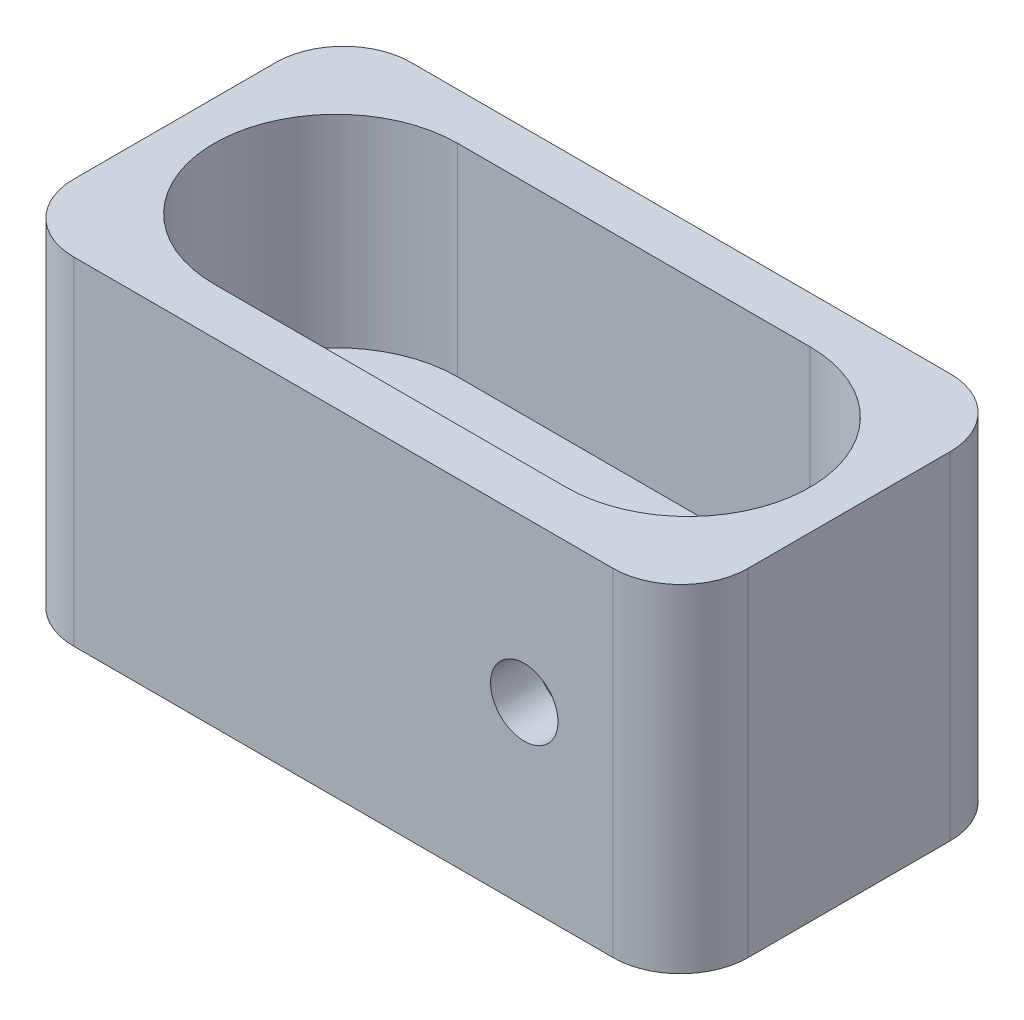
ISO-10303-21;
HEADER;
FILE_DESCRIPTION(('STEP AP214'),'2;1');
FILE_NAME('part.step','',(''),(''),'','','');
FILE_SCHEMA(('AUTOMOTIVE_DESIGN { 1 0 10303 214 1 1 1 1 }'));
ENDSEC;
DATA;
#1=APPLICATION_CONTEXT('core data for automotive mechanical design processes');
#2=APPLICATION_PROTOCOL_DEFINITION('international standard','automotive_design',2000,#1);
#3=PRODUCT_CONTEXT('',#1,'mechanical');
#4=PRODUCT('Part','Part','',(#3));
#5=PRODUCT_RELATED_PRODUCT_CATEGORY('part','',(#4));
#6=PRODUCT_DEFINITION_FORMATION('','',#4);
#7=PRODUCT_DEFINITION_CONTEXT('part definition',#1,'design');
#8=PRODUCT_DEFINITION('design','',#6,#7);
#9=PRODUCT_DEFINITION_SHAPE('','',#8);
#10=(LENGTH_UNIT() NAMED_UNIT(*) SI_UNIT(.MILLI.,.METRE.));
#11=(NAMED_UNIT(*) PLANE_ANGLE_UNIT() SI_UNIT($,.RADIAN.));
#12=(NAMED_UNIT(*) SI_UNIT($,.STERADIAN.) SOLID_ANGLE_UNIT());
#13=UNCERTAINTY_MEASURE_WITH_UNIT(LENGTH_MEASURE(1.E-05),#10,'distance_accuracy_value','');
#14=(GEOMETRIC_REPRESENTATION_CONTEXT(3) GLOBAL_UNCERTAINTY_ASSIGNED_CONTEXT((#13)) GLOBAL_UNIT_ASSIGNED_CONTEXT((#10,
#11,#12)) REPRESENTATION_CONTEXT('',''));
#15=CARTESIAN_POINT('',(0.,0.,0.));
#16=DIRECTION('',(0.,0.,1.));
#17=DIRECTION('',(1.,0.,0.));
#18=AXIS2_PLACEMENT_3D('',#15,#16,#17);
#19=CARTESIAN_POINT('',(25.,25.,12.5));
#20=DIRECTION('',(-1.,0.,0.));
#21=DIRECTION('',(0.,0.,1.));
#22=AXIS2_PLACEMENT_3D('',#19,#20,#21);
#23=PLANE('',#22);
#24=DIRECTION('',(0.,0.,-1.));
#25=VECTOR('',#24,1.);
#26=CARTESIAN_POINT('',(25.,0.,12.5));
#27=LINE('',#26,#25);
#28=CARTESIAN_POINT('',(25.,0.,7.5));
#29=VERTEX_POINT('',#28);
#30=CARTESIAN_POINT('',(25.,0.,-7.5));
#31=VERTEX_POINT('',#30);
#32=EDGE_CURVE('E162',#29,#31,#27,.T.);
#33=ORIENTED_EDGE('',*,*,#32,.T.);
#34=DIRECTION('',(0.,-1.,0.));
#35=VECTOR('',#34,1.);
#36=CARTESIAN_POINT('',(25.,25.,-7.5));
#37=LINE('',#36,#35);
#38=CARTESIAN_POINT('',(25.,25.,-7.5));
#39=VERTEX_POINT('',#38);
#40=EDGE_CURVE('E189',#31,#39,#37,.F.);
#41=ORIENTED_EDGE('',*,*,#40,.T.);
#42=DIRECTION('',(0.,0.,-1.));
#43=VECTOR('',#42,1.);
#44=CARTESIAN_POINT('',(25.,25.,12.5));
#45=LINE('',#44,#43);
#46=CARTESIAN_POINT('',(25.,25.,7.5));
#47=VERTEX_POINT('',#46);
#48=EDGE_CURVE('E148',#47,#39,#45,.T.);
#49=ORIENTED_EDGE('',*,*,#48,.F.);
#50=DIRECTION('',(0.,-1.,0.));
#51=VECTOR('',#50,1.);
#52=CARTESIAN_POINT('',(25.,25.,7.5));
#53=LINE('',#52,#51);
#54=EDGE_CURVE('E186',#47,#29,#53,.T.);
#55=ORIENTED_EDGE('',*,*,#54,.T.);
#56=EDGE_LOOP('',(#33,#41,#49,#55));
#57=FACE_BOUND('',#56,.T.);
#58=ADVANCED_FACE('F32',(#57),#23,.F.);
#59=CARTESIAN_POINT('',(-25.,25.,-12.5));
#60=DIRECTION('',(0.,0.,1.));
#61=DIRECTION('',(1.,0.,0.));
#62=AXIS2_PLACEMENT_3D('',#59,#60,#61);
#63=PLANE('',#62);
#64=DIRECTION('',(-1.,0.,0.));
#65=VECTOR('',#64,1.);
#66=CARTESIAN_POINT('',(-25.,25.,-12.5));
#67=LINE('',#66,#65);
#68=CARTESIAN_POINT('',(20.,25.,-12.5));
#69=VERTEX_POINT('',#68);
#70=CARTESIAN_POINT('',(-20.,25.,-12.5));
#71=VERTEX_POINT('',#70);
#72=EDGE_CURVE('E151',#69,#71,#67,.T.);
#73=ORIENTED_EDGE('',*,*,#72,.F.);
#74=DIRECTION('',(0.,-1.,0.));
#75=VECTOR('',#74,1.);
#76=CARTESIAN_POINT('',(20.,25.,-12.5));
#77=LINE('',#76,#75);
#78=CARTESIAN_POINT('',(20.,0.,-12.5));
#79=VERTEX_POINT('',#78);
#80=EDGE_CURVE('E175',#69,#79,#77,.T.);
#81=ORIENTED_EDGE('',*,*,#80,.T.);
#82=DIRECTION('',(-1.,0.,0.));
#83=VECTOR('',#82,1.);
#84=CARTESIAN_POINT('',(-25.,0.,-12.5));
#85=LINE('',#84,#83);
#86=CARTESIAN_POINT('',(-20.,0.,-12.5));
#87=VERTEX_POINT('',#86);
#88=EDGE_CURVE('E165',#79,#87,#85,.T.);
#89=ORIENTED_EDGE('',*,*,#88,.T.);
#90=DIRECTION('',(0.,-1.,0.));
#91=VECTOR('',#90,1.);
#92=CARTESIAN_POINT('',(-20.,25.,-12.5));
#93=LINE('',#92,#91);
#94=EDGE_CURVE('E161',#87,#71,#93,.F.);
#95=ORIENTED_EDGE('',*,*,#94,.T.);
#96=EDGE_LOOP('',(#73,#81,#89,#95));
#97=FACE_BOUND('',#96,.T.);
#98=ADVANCED_FACE('F241',(#97),#63,.F.);
#99=CARTESIAN_POINT('',(-25.,25.,12.5));
#100=DIRECTION('',(1.,0.,0.));
#101=DIRECTION('',(0.,0.,-1.));
#102=AXIS2_PLACEMENT_3D('',#99,#100,#101);
#103=PLANE('',#102);
#104=DIRECTION('',(0.,0.,1.));
#105=VECTOR('',#104,1.);
#106=CARTESIAN_POINT('',(-25.,0.,12.5));
#107=LINE('',#106,#105);
#108=CARTESIAN_POINT('',(-25.,0.,-7.5));
#109=VERTEX_POINT('',#108);
#110=CARTESIAN_POINT('',(-25.,0.,7.5));
#111=VERTEX_POINT('',#110);
#112=EDGE_CURVE('E169',#109,#111,#107,.T.);
#113=ORIENTED_EDGE('',*,*,#112,.T.);
#114=DIRECTION('',(0.,-1.,0.));
#115=VECTOR('',#114,1.);
#116=CARTESIAN_POINT('',(-25.,25.,7.5));
#117=LINE('',#116,#115);
#118=CARTESIAN_POINT('',(-25.,25.,7.5));
#119=VERTEX_POINT('',#118);
#120=EDGE_CURVE('E40',#111,#119,#117,.F.);
#121=ORIENTED_EDGE('',*,*,#120,.T.);
#122=DIRECTION('',(0.,0.,1.));
#123=VECTOR('',#122,1.);
#124=CARTESIAN_POINT('',(-25.,25.,12.5));
#125=LINE('',#124,#123);
#126=CARTESIAN_POINT('',(-25.,25.,-7.5));
#127=VERTEX_POINT('',#126);
#128=EDGE_CURVE('E155',#127,#119,#125,.T.);
#129=ORIENTED_EDGE('',*,*,#128,.F.);
#130=DIRECTION('',(0.,-1.,0.));
#131=VECTOR('',#130,1.);
#132=CARTESIAN_POINT('',(-25.,25.,-7.5));
#133=LINE('',#132,#131);
#134=EDGE_CURVE('E204',#127,#109,#133,.T.);
#135=ORIENTED_EDGE('',*,*,#134,.T.);
#136=EDGE_LOOP('',(#113,#121,#129,#135));
#137=FACE_BOUND('',#136,.T.);
#138=ADVANCED_FACE('F209',(#137),#103,.F.);
#139=CARTESIAN_POINT('',(-25.,25.,12.5));
#140=DIRECTION('',(0.,0.,-1.));
#141=DIRECTION('',(-1.,0.,0.));
#142=AXIS2_PLACEMENT_3D('',#139,#140,#141);
#143=PLANE('',#142);
#144=CARTESIAN_POINT('',(13.4083811728094,13.1057810338434,12.5));
#145=DIRECTION('',(0.,0.,1.));
#146=DIRECTION('',(1.,0.,0.));
#147=AXIS2_PLACEMENT_3D('',#144,#145,#146);
#148=CIRCLE('',#147,2.5);
#149=CARTESIAN_POINT('',(15.9083811728094,13.1057810338434,12.5));
#150=VERTEX_POINT('',#149);
#151=EDGE_CURVE('E134',#150,#150,#148,.T.);
#152=ORIENTED_EDGE('',*,*,#151,.F.);
#153=EDGE_LOOP('',(#152));
#154=FACE_BOUND('',#153,.T.);
#155=DIRECTION('',(1.,0.,0.));
#156=VECTOR('',#155,1.);
#157=CARTESIAN_POINT('',(-25.,0.,12.5));
#158=LINE('',#157,#156);
#159=CARTESIAN_POINT('',(-20.,0.,12.5));
#160=VERTEX_POINT('',#159);
#161=CARTESIAN_POINT('',(20.,0.,12.5));
#162=VERTEX_POINT('',#161);
#163=EDGE_CURVE('E152',#160,#162,#158,.T.);
#164=ORIENTED_EDGE('',*,*,#163,.T.);
#165=DIRECTION('',(0.,-1.,0.));
#166=VECTOR('',#165,1.);
#167=CARTESIAN_POINT('',(20.,25.,12.5));
#168=LINE('',#167,#166);
#169=CARTESIAN_POINT('',(20.,25.,12.5));
#170=VERTEX_POINT('',#169);
#171=EDGE_CURVE('E202',#162,#170,#168,.F.);
#172=ORIENTED_EDGE('',*,*,#171,.T.);
#173=DIRECTION('',(1.,0.,0.));
#174=VECTOR('',#173,1.);
#175=CARTESIAN_POINT('',(-25.,25.,12.5));
#176=LINE('',#175,#174);
#177=CARTESIAN_POINT('',(-20.,25.,12.5));
#178=VERTEX_POINT('',#177);
#179=EDGE_CURVE('E158',#178,#170,#176,.T.);
#180=ORIENTED_EDGE('',*,*,#179,.F.);
#181=DIRECTION('',(0.,-1.,0.));
#182=VECTOR('',#181,1.);
#183=CARTESIAN_POINT('',(-20.,25.,12.5));
#184=LINE('',#183,#182);
#185=EDGE_CURVE('E199',#178,#160,#184,.T.);
#186=ORIENTED_EDGE('',*,*,#185,.T.);
#187=EDGE_LOOP('',(#164,#172,#180,#186));
#188=FACE_BOUND('',#187,.T.);
#189=ADVANCED_FACE('F222',(#154,#188),#143,.F.);
#190=CARTESIAN_POINT('',(0.,25.,0.));
#191=DIRECTION('',(0.,-1.,0.));
#192=DIRECTION('',(0.,0.,-1.));
#193=AXIS2_PLACEMENT_3D('',#190,#191,#192);
#194=PLANE('',#193);
#195=DIRECTION('',(1.,0.,0.));
#196=VECTOR('',#195,1.);
#197=CARTESIAN_POINT('',(-13.0583517016237,25.,9.03424740173566));
#198=LINE('',#197,#196);
#199=CARTESIAN_POINT('',(-13.0583517016237,25.,9.03424740173566));
#200=VERTEX_POINT('',#199);
#201=CARTESIAN_POINT('',(13.06,25.,9.03424740173566));
#202=VERTEX_POINT('',#201);
#203=EDGE_CURVE('E138',#200,#202,#198,.T.);
#204=ORIENTED_EDGE('',*,*,#203,.F.);
#205=CARTESIAN_POINT('',(-13.0583517016237,25.,0.));
#206=DIRECTION('',(0.,1.,0.));
#207=DIRECTION('',(0.,0.,1.));
#208=AXIS2_PLACEMENT_3D('',#205,#206,#207);
#209=CIRCLE('',#208,9.03424740173566);
#210=CARTESIAN_POINT('',(-13.0583517016237,25.,-9.03424740173566));
#211=VERTEX_POINT('',#210);
#212=EDGE_CURVE('E53',#211,#200,#209,.T.);
#213=ORIENTED_EDGE('',*,*,#212,.F.);
#214=DIRECTION('',(-1.,0.,0.));
#215=VECTOR('',#214,1.);
#216=CARTESIAN_POINT('',(-13.0583517016237,25.,-9.03424740173566));
#217=LINE('',#216,#215);
#218=CARTESIAN_POINT('',(13.06,25.,-9.03424740173566));
#219=VERTEX_POINT('',#218);
#220=EDGE_CURVE('E390',#219,#211,#217,.T.);
#221=ORIENTED_EDGE('',*,*,#220,.F.);
#222=CARTESIAN_POINT('',(13.06,25.,0.));
#223=DIRECTION('',(0.,1.,0.));
#224=DIRECTION('',(0.,0.,1.));
#225=AXIS2_PLACEMENT_3D('',#222,#223,#224);
#226=CIRCLE('',#225,9.03424740173566);
#227=EDGE_CURVE('E400',#202,#219,#226,.T.);
#228=ORIENTED_EDGE('',*,*,#227,.F.);
#229=EDGE_LOOP('',(#204,#213,#221,#228));
#230=FACE_BOUND('',#229,.T.);
#231=ORIENTED_EDGE('',*,*,#48,.T.);
#232=CARTESIAN_POINT('',(20.,25.,-7.5));
#233=DIRECTION('',(0.,-1.,0.));
#234=DIRECTION('',(0.,0.,-1.));
#235=AXIS2_PLACEMENT_3D('',#232,#233,#234);
#236=CIRCLE('',#235,5.);
#237=EDGE_CURVE('E197',#39,#69,#236,.F.);
#238=ORIENTED_EDGE('',*,*,#237,.T.);
#239=ORIENTED_EDGE('',*,*,#72,.T.);
#240=CARTESIAN_POINT('',(-20.,25.,-7.5));
#241=DIRECTION('',(0.,-1.,0.));
#242=DIRECTION('',(0.,0.,-1.));
#243=AXIS2_PLACEMENT_3D('',#240,#241,#242);
#244=CIRCLE('',#243,5.);
#245=EDGE_CURVE('E191',#71,#127,#244,.F.);
#246=ORIENTED_EDGE('',*,*,#245,.T.);
#247=ORIENTED_EDGE('',*,*,#128,.T.);
#248=CARTESIAN_POINT('',(-20.,25.,7.5));
#249=DIRECTION('',(0.,-1.,0.));
#250=DIRECTION('',(0.,0.,-1.));
#251=AXIS2_PLACEMENT_3D('',#248,#249,#250);
#252=CIRCLE('',#251,5.);
#253=EDGE_CURVE('E193',#119,#178,#252,.F.);
#254=ORIENTED_EDGE('',*,*,#253,.T.);
#255=ORIENTED_EDGE('',*,*,#179,.T.);
#256=CARTESIAN_POINT('',(20.,25.,7.5));
#257=DIRECTION('',(0.,-1.,0.));
#258=DIRECTION('',(0.,0.,-1.));
#259=AXIS2_PLACEMENT_3D('',#256,#257,#258);
#260=CIRCLE('',#259,5.);
#261=EDGE_CURVE('E195',#170,#47,#260,.F.);
#262=ORIENTED_EDGE('',*,*,#261,.T.);
#263=EDGE_LOOP('',(#231,#238,#239,#246,#247,#254,#255,#262));
#264=FACE_BOUND('',#263,.T.);
#265=ADVANCED_FACE('F215',(#230,#264),#194,.F.);
#266=CARTESIAN_POINT('',(0.,0.,0.));
#267=DIRECTION('',(0.,-1.,0.));
#268=DIRECTION('',(0.,0.,-1.));
#269=AXIS2_PLACEMENT_3D('',#266,#267,#268);
#270=PLANE('',#269);
#271=ORIENTED_EDGE('',*,*,#88,.F.);
#272=CARTESIAN_POINT('',(20.,0.,-7.5));
#273=DIRECTION('',(0.,-1.,0.));
#274=DIRECTION('',(0.,0.,-1.));
#275=AXIS2_PLACEMENT_3D('',#272,#273,#274);
#276=CIRCLE('',#275,5.);
#277=EDGE_CURVE('E184',#79,#31,#276,.T.);
#278=ORIENTED_EDGE('',*,*,#277,.T.);
#279=ORIENTED_EDGE('',*,*,#32,.F.);
#280=CARTESIAN_POINT('',(20.,0.,7.5));
#281=DIRECTION('',(0.,-1.,0.));
#282=DIRECTION('',(0.,0.,-1.));
#283=AXIS2_PLACEMENT_3D('',#280,#281,#282);
#284=CIRCLE('',#283,5.);
#285=EDGE_CURVE('E182',#29,#162,#284,.T.);
#286=ORIENTED_EDGE('',*,*,#285,.T.);
#287=ORIENTED_EDGE('',*,*,#163,.F.);
#288=CARTESIAN_POINT('',(-20.,0.,7.5));
#289=DIRECTION('',(0.,-1.,0.));
#290=DIRECTION('',(0.,0.,-1.));
#291=AXIS2_PLACEMENT_3D('',#288,#289,#290);
#292=CIRCLE('',#291,5.);
#293=EDGE_CURVE('E180',#160,#111,#292,.T.);
#294=ORIENTED_EDGE('',*,*,#293,.T.);
#295=ORIENTED_EDGE('',*,*,#112,.F.);
#296=CARTESIAN_POINT('',(-20.,0.,-7.5));
#297=DIRECTION('',(0.,-1.,0.));
#298=DIRECTION('',(0.,0.,-1.));
#299=AXIS2_PLACEMENT_3D('',#296,#297,#298);
#300=CIRCLE('',#299,5.);
#301=EDGE_CURVE('E178',#109,#87,#300,.T.);
#302=ORIENTED_EDGE('',*,*,#301,.T.);
#303=EDGE_LOOP('',(#271,#278,#279,#286,#287,#294,#295,#302));
#304=FACE_BOUND('',#303,.T.);
#305=ADVANCED_FACE('F226',(#304),#270,.T.);
#306=CARTESIAN_POINT('',(20.,25.,-7.5));
#307=DIRECTION('',(0.,-1.,0.));
#308=DIRECTION('',(0.,0.,-1.));
#309=AXIS2_PLACEMENT_3D('',#306,#307,#308);
#310=CYLINDRICAL_SURFACE('',#309,5.);
#311=ORIENTED_EDGE('',*,*,#237,.F.);
#312=ORIENTED_EDGE('',*,*,#40,.F.);
#313=ORIENTED_EDGE('',*,*,#277,.F.);
#314=ORIENTED_EDGE('',*,*,#80,.F.);
#315=EDGE_LOOP('',(#311,#312,#313,#314));
#316=FACE_BOUND('',#315,.T.);
#317=ADVANCED_FACE('F239',(#316),#310,.T.);
#318=CARTESIAN_POINT('',(20.,25.,7.5));
#319=DIRECTION('',(0.,-1.,0.));
#320=DIRECTION('',(0.,0.,-1.));
#321=AXIS2_PLACEMENT_3D('',#318,#319,#320);
#322=CYLINDRICAL_SURFACE('',#321,5.);
#323=ORIENTED_EDGE('',*,*,#261,.F.);
#324=ORIENTED_EDGE('',*,*,#171,.F.);
#325=ORIENTED_EDGE('',*,*,#285,.F.);
#326=ORIENTED_EDGE('',*,*,#54,.F.);
#327=EDGE_LOOP('',(#323,#324,#325,#326));
#328=FACE_BOUND('',#327,.T.);
#329=ADVANCED_FACE('F231',(#328),#322,.T.);
#330=CARTESIAN_POINT('',(-20.,25.,7.5));
#331=DIRECTION('',(0.,-1.,0.));
#332=DIRECTION('',(0.,0.,-1.));
#333=AXIS2_PLACEMENT_3D('',#330,#331,#332);
#334=CYLINDRICAL_SURFACE('',#333,5.);
#335=ORIENTED_EDGE('',*,*,#253,.F.);
#336=ORIENTED_EDGE('',*,*,#120,.F.);
#337=ORIENTED_EDGE('',*,*,#293,.F.);
#338=ORIENTED_EDGE('',*,*,#185,.F.);
#339=EDGE_LOOP('',(#335,#336,#337,#338));
#340=FACE_BOUND('',#339,.T.);
#341=ADVANCED_FACE('F219',(#340),#334,.T.);
#342=CARTESIAN_POINT('',(-20.,25.,-7.5));
#343=DIRECTION('',(0.,-1.,0.));
#344=DIRECTION('',(0.,0.,-1.));
#345=AXIS2_PLACEMENT_3D('',#342,#343,#344);
#346=CYLINDRICAL_SURFACE('',#345,5.);
#347=ORIENTED_EDGE('',*,*,#245,.F.);
#348=ORIENTED_EDGE('',*,*,#94,.F.);
#349=ORIENTED_EDGE('',*,*,#301,.F.);
#350=ORIENTED_EDGE('',*,*,#134,.F.);
#351=EDGE_LOOP('',(#347,#348,#349,#350));
#352=FACE_BOUND('',#351,.T.);
#353=ADVANCED_FACE('F34',(#352),#346,.T.);
#354=CARTESIAN_POINT('',(-13.0583517016237,10.,0.));
#355=DIRECTION('',(0.,1.,0.));
#356=DIRECTION('',(0.,0.,1.));
#357=AXIS2_PLACEMENT_3D('',#354,#355,#356);
#358=CYLINDRICAL_SURFACE('',#357,9.03424740173566);
#359=ORIENTED_EDGE('',*,*,#212,.T.);
#360=DIRECTION('',(0.,1.,0.));
#361=VECTOR('',#360,1.);
#362=CARTESIAN_POINT('',(-13.0583517016237,10.,9.03424740173566));
#363=LINE('',#362,#361);
#364=CARTESIAN_POINT('',(-13.0583517016237,10.,9.03424740173566));
#365=VERTEX_POINT('',#364);
#366=EDGE_CURVE('E140',#365,#200,#363,.T.);
#367=ORIENTED_EDGE('',*,*,#366,.F.);
#368=CARTESIAN_POINT('',(-13.0583517016237,10.,0.));
#369=DIRECTION('',(0.,1.,0.));
#370=DIRECTION('',(0.,0.,1.));
#371=AXIS2_PLACEMENT_3D('',#368,#369,#370);
#372=CIRCLE('',#371,9.03424740173566);
#373=CARTESIAN_POINT('',(-13.0583517016237,10.,-9.03424740173566));
#374=VERTEX_POINT('',#373);
#375=EDGE_CURVE('E358',#374,#365,#372,.T.);
#376=ORIENTED_EDGE('',*,*,#375,.F.);
#377=DIRECTION('',(0.,1.,0.));
#378=VECTOR('',#377,1.);
#379=CARTESIAN_POINT('',(-13.0583517016237,10.,-9.03424740173566));
#380=LINE('',#379,#378);
#381=EDGE_CURVE('E166',#374,#211,#380,.T.);
#382=ORIENTED_EDGE('',*,*,#381,.T.);
#383=EDGE_LOOP('',(#359,#367,#376,#382));
#384=FACE_BOUND('',#383,.T.);
#385=ADVANCED_FACE('F245',(#384),#358,.F.);
#386=CARTESIAN_POINT('',(-13.0583517016237,10.,-9.03424740173566));
#387=DIRECTION('',(0.,0.,-1.));
#388=DIRECTION('',(-1.,0.,0.));
#389=AXIS2_PLACEMENT_3D('',#386,#387,#388);
#390=PLANE('',#389);
#391=ORIENTED_EDGE('',*,*,#220,.T.);
#392=ORIENTED_EDGE('',*,*,#381,.F.);
#393=DIRECTION('',(-1.,0.,0.));
#394=VECTOR('',#393,1.);
#395=CARTESIAN_POINT('',(-13.0583517016237,10.,-9.03424740173566));
#396=LINE('',#395,#394);
#397=CARTESIAN_POINT('',(13.06,10.,-9.03424740173566));
#398=VERTEX_POINT('',#397);
#399=EDGE_CURVE('E143',#398,#374,#396,.T.);
#400=ORIENTED_EDGE('',*,*,#399,.F.);
#401=DIRECTION('',(0.,1.,0.));
#402=VECTOR('',#401,1.);
#403=CARTESIAN_POINT('',(13.06,10.,-9.03424740173566));
#404=LINE('',#403,#402);
#405=EDGE_CURVE('E142',#398,#219,#404,.T.);
#406=ORIENTED_EDGE('',*,*,#405,.T.);
#407=EDGE_LOOP('',(#391,#392,#400,#406));
#408=FACE_BOUND('',#407,.T.);
#409=ADVANCED_FACE('F250',(#408),#390,.F.);
#410=CARTESIAN_POINT('',(13.06,10.,0.));
#411=DIRECTION('',(0.,1.,0.));
#412=DIRECTION('',(0.,0.,1.));
#413=AXIS2_PLACEMENT_3D('',#410,#411,#412);
#414=CYLINDRICAL_SURFACE('',#413,9.03424740173566);
#415=DIRECTION('',(0.,1.,0.));
#416=VECTOR('',#415,1.);
#417=CARTESIAN_POINT('',(13.06,10.,9.03424740173566));
#418=LINE('',#417,#416);
#419=CARTESIAN_POINT('',(13.06,10.,9.03424740173566));
#420=VERTEX_POINT('',#419);
#421=CARTESIAN_POINT('',(13.06,10.6301739247827,9.03424740173566));
#422=VERTEX_POINT('',#421);
#423=EDGE_CURVE('E133',#420,#422,#418,.T.);
#424=ORIENTED_EDGE('',*,*,#423,.T.);
#425=CARTESIAN_POINT('',(13.06,10.6301739247827,9.03424740173566));
#426=CARTESIAN_POINT('',(13.1279528438603,10.6206029462939,9.03425481954565));
#427=CARTESIAN_POINT('',(13.1962982730374,10.6138465103983,9.03348090188546));
#428=CARTESIAN_POINT('',(13.3332685685971,10.6059704971446,9.03037138590478));
#429=CARTESIAN_POINT('',(13.401893395128,10.6048501422609,9.02803600304657));
#430=CARTESIAN_POINT('',(13.5387881686374,10.6082477562269,9.02181126035708));
#431=CARTESIAN_POINT('',(13.607058561637,10.6127535843459,9.01792525889965));
#432=CARTESIAN_POINT('',(13.7428834693758,10.6273178192523,9.00865919472031));
#433=CARTESIAN_POINT('',(13.8104379824869,10.6373762386646,9.00327912860136));
#434=CARTESIAN_POINT('',(14.0113200790648,10.675759330918,8.98502135248513));
#435=CARTESIAN_POINT('',(14.1429864354689,10.712295021447,8.9700204148186));
#436=CARTESIAN_POINT('',(14.3980646714134,10.8059922521536,8.93553783068328));
#437=CARTESIAN_POINT('',(14.5214743869393,10.8631591747406,8.91605501543461));
#438=CARTESIAN_POINT('',(14.7595437652972,10.9978338637343,8.87378688452132));
#439=CARTESIAN_POINT('',(14.8739662368607,11.0757423098316,8.85094098383301));
#440=CARTESIAN_POINT('',(15.0883342460892,11.2492287277974,8.80429142704468));
#441=CARTESIAN_POINT('',(15.188275194255,11.3448122795286,8.78048747035725));
#442=CARTESIAN_POINT('',(15.3740775994836,11.5545646233458,8.73339318967604));
#443=CARTESIAN_POINT('',(15.4593975236474,11.669223305878,8.71014255224018));
#444=CARTESIAN_POINT('',(15.6095190736544,11.9119045349237,8.66739262914024));
#445=CARTESIAN_POINT('',(15.6743237336001,12.0399251015555,8.64789278892001));
#446=CARTESIAN_POINT('',(15.7805025571845,12.3039198210174,8.61507720365937));
#447=CARTESIAN_POINT('',(15.8222032571572,12.4397515034749,8.60167577976114));
#448=CARTESIAN_POINT('',(15.8820320104034,12.7170080003583,8.5822359088984));
#449=CARTESIAN_POINT('',(15.9001683839514,12.8584308224374,8.57619486312165));
#450=CARTESIAN_POINT('',(15.9118736392851,13.1358218424619,8.57230836513335));
#451=CARTESIAN_POINT('',(15.9065403657529,13.2717396735176,8.57409665776824));
#452=CARTESIAN_POINT('',(15.873993977417,13.5406281501454,8.58483266236341));
#453=CARTESIAN_POINT('',(15.8467816359646,13.6735988997164,8.59378012127121));
#454=CARTESIAN_POINT('',(15.7718570810657,13.9315144249437,8.61771247239089));
#455=CARTESIAN_POINT('',(15.7243609086468,14.0565282634075,8.63263363735656));
#456=CARTESIAN_POINT('',(15.6104034225728,14.2969157015593,8.66698304727564));
#457=CARTESIAN_POINT('',(15.5439381481868,14.4122872814417,8.68641223334106));
#458=CARTESIAN_POINT('',(15.3908228261353,14.6351372265756,8.72877050121979));
#459=CARTESIAN_POINT('',(15.303467012733,14.7421098141736,8.75180910863916));
#460=CARTESIAN_POINT('',(15.1124570512389,14.9401920777391,8.79856242300226));
#461=CARTESIAN_POINT('',(15.0087999766664,15.0312988992072,8.82227725071725));
#462=CARTESIAN_POINT('',(14.7839294595119,15.198178226857,8.86900806957002));
#463=CARTESIAN_POINT('',(14.6622388376191,15.2733238616351,8.89197286603918));
#464=CARTESIAN_POINT('',(14.4072577747027,15.4020021244802,8.93415891248267));
#465=CARTESIAN_POINT('',(14.2739648401611,15.4555300925639,8.95337935484861));
#466=CARTESIAN_POINT('',(14.001608260272,15.5384869215766,8.98607473519366));
#467=CARTESIAN_POINT('',(13.8626594860251,15.5682613454919,8.99963063935949));
#468=CARTESIAN_POINT('',(13.5813847431312,15.6037964315121,9.02028644320295));
#469=CARTESIAN_POINT('',(13.4390656022754,15.6096020580297,9.02739841183081));
#470=CARTESIAN_POINT('',(13.2576674452506,15.6015535505008,9.03217363105389));
#471=CARTESIAN_POINT('',(13.21797348925,15.598838100642,9.03295358182743));
#472=CARTESIAN_POINT('',(13.1388148808234,15.5915214087024,9.03398959536707));
#473=CARTESIAN_POINT('',(13.0993499683294,15.5869230963408,9.03424646834562));
#474=CARTESIAN_POINT('',(13.06,15.5813881429041,9.03424740173566));
#475=B_SPLINE_CURVE_WITH_KNOTS('',3,(#425,#426,#427,#428,#429,#430,#431,#432,#433,#434,#435,
#436,#437,#438,#439,#440,#441,#442,#443,#444,#445,#446,#447,#448,#449,#450,#451,#452,#453,#454,
#455,#456,#457,#458,#459,#460,#461,#462,#463,#464,#465,#466,#467,#468,#469,#470,#471,#472,#473,
#474),.UNSPECIFIED.,.F.,.F.,(4,2,2,2,2,2,2,2,2,2,2,2,2,2,2,2,2,2,2,2,2,2,2,2,4),(0.,
0.205801534135691,0.411574676142847,0.616904547024398,0.822234884766691,1.23253895208468,
1.64295013965427,2.06195097387669,2.48108430919436,2.91339694006557,3.34564560421068,
3.77161825204659,4.19744045325902,4.6035610660957,5.00966732456767,5.41155202364204,
5.81352069733653,6.23169589208509,6.64994624553285,7.08242070867019,7.51498834789077,
7.94114205482884,8.36649595183001,8.48584742429765,8.60501388828305),.UNSPECIFIED.);
#476=CARTESIAN_POINT('',(13.06,15.5813881429041,9.03424740173566));
#477=VERTEX_POINT('',#476);
#478=EDGE_CURVE('E46',#422,#477,#475,.T.);
#479=ORIENTED_EDGE('',*,*,#478,.T.);
#480=EDGE_CURVE('E130',#477,#202,#418,.T.);
#481=ORIENTED_EDGE('',*,*,#480,.T.);
#482=ORIENTED_EDGE('',*,*,#227,.T.);
#483=ORIENTED_EDGE('',*,*,#405,.F.);
#484=CARTESIAN_POINT('',(13.06,10.,0.));
#485=DIRECTION('',(0.,1.,0.));
#486=DIRECTION('',(0.,0.,1.));
#487=AXIS2_PLACEMENT_3D('',#484,#485,#486);
#488=CIRCLE('',#487,9.03424740173566);
#489=EDGE_CURVE('E393',#420,#398,#488,.T.);
#490=ORIENTED_EDGE('',*,*,#489,.F.);
#491=EDGE_LOOP('',(#424,#479,#481,#482,#483,#490));
#492=FACE_BOUND('',#491,.T.);
#493=ADVANCED_FACE('F128',(#492),#414,.F.);
#494=CARTESIAN_POINT('',(-13.0583517016237,10.,9.03424740173566));
#495=DIRECTION('',(0.,0.,1.));
#496=DIRECTION('',(1.,0.,0.));
#497=AXIS2_PLACEMENT_3D('',#494,#495,#496);
#498=PLANE('',#497);
#499=ORIENTED_EDGE('',*,*,#480,.F.);
#500=CARTESIAN_POINT('',(13.4083811728094,13.1057810338434,9.03424740173566));
#501=DIRECTION('',(0.,0.,1.));
#502=DIRECTION('',(1.,0.,0.));
#503=AXIS2_PLACEMENT_3D('',#500,#501,#502);
#504=CIRCLE('',#503,2.5);
#505=EDGE_CURVE('E11',#477,#422,#504,.T.);
#506=ORIENTED_EDGE('',*,*,#505,.T.);
#507=ORIENTED_EDGE('',*,*,#423,.F.);
#508=DIRECTION('',(1.,0.,0.));
#509=VECTOR('',#508,1.);
#510=CARTESIAN_POINT('',(-13.0583517016237,10.,9.03424740173566));
#511=LINE('',#510,#509);
#512=EDGE_CURVE('E389',#365,#420,#511,.T.);
#513=ORIENTED_EDGE('',*,*,#512,.F.);
#514=ORIENTED_EDGE('',*,*,#366,.T.);
#515=ORIENTED_EDGE('',*,*,#203,.T.);
#516=EDGE_LOOP('',(#499,#506,#507,#513,#514,#515));
#517=FACE_BOUND('',#516,.T.);
#518=ADVANCED_FACE('F136',(#517),#498,.F.);
#519=CARTESIAN_POINT('',(-13.0583517016237,10.,0.));
#520=DIRECTION('',(0.,1.,0.));
#521=DIRECTION('',(0.,0.,1.));
#522=AXIS2_PLACEMENT_3D('',#519,#520,#521);
#523=PLANE('',#522);
#524=ORIENTED_EDGE('',*,*,#375,.T.);
#525=ORIENTED_EDGE('',*,*,#512,.T.);
#526=ORIENTED_EDGE('',*,*,#489,.T.);
#527=ORIENTED_EDGE('',*,*,#399,.T.);
#528=EDGE_LOOP('',(#524,#525,#526,#527));
#529=FACE_BOUND('',#528,.T.);
#530=ADVANCED_FACE('F310',(#529),#523,.T.);
#531=CARTESIAN_POINT('',(13.4083811728094,13.1057810338434,2.5));
#532=DIRECTION('',(0.,0.,1.));
#533=DIRECTION('',(1.,0.,0.));
#534=AXIS2_PLACEMENT_3D('',#531,#532,#533);
#535=CYLINDRICAL_SURFACE('',#534,2.5);
#536=ORIENTED_EDGE('',*,*,#151,.T.);
#537=EDGE_LOOP('',(#536));
#538=FACE_BOUND('',#537,.T.);
#539=ORIENTED_EDGE('',*,*,#505,.F.);
#540=ORIENTED_EDGE('',*,*,#478,.F.);
#541=EDGE_LOOP('',(#539,#540));
#542=FACE_BOUND('',#541,.T.);
#543=ADVANCED_FACE('F123',(#538,#542),#535,.F.);
#544=CLOSED_SHELL('',(#58,#98,#138,#189,#265,#305,#317,#329,#341,#353,#385,#409,#493,#518,#530,#543));
#545=MANIFOLD_SOLID_BREP('B2',#544);
#546=ADVANCED_BREP_SHAPE_REPRESENTATION('',(#18,#545),#14);
#547=SHAPE_DEFINITION_REPRESENTATION(#9,#546);
ENDSEC;
END-ISO-10303-21;
